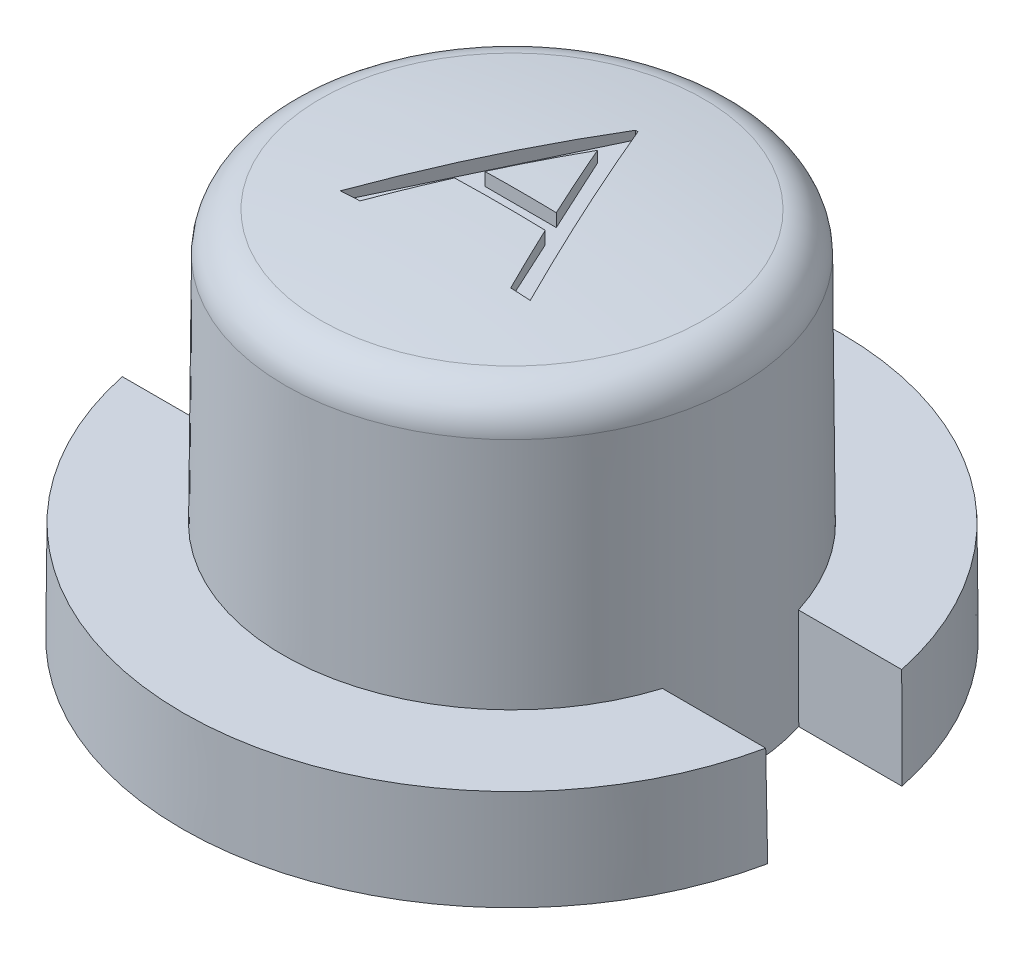
ISO-10303-21;
HEADER;
FILE_DESCRIPTION(('STEP AP214'),'2;1');
FILE_NAME('part.step','',(''),(''),'','','');
FILE_SCHEMA(('AUTOMOTIVE_DESIGN { 1 0 10303 214 1 1 1 1 }'));
ENDSEC;
DATA;
#1=APPLICATION_CONTEXT('core data for automotive mechanical design processes');
#2=APPLICATION_PROTOCOL_DEFINITION('international standard','automotive_design',2000,#1);
#3=PRODUCT_CONTEXT('',#1,'mechanical');
#4=PRODUCT('Part','Part','',(#3));
#5=PRODUCT_RELATED_PRODUCT_CATEGORY('part','',(#4));
#6=PRODUCT_DEFINITION_FORMATION('','',#4);
#7=PRODUCT_DEFINITION_CONTEXT('part definition',#1,'design');
#8=PRODUCT_DEFINITION('design','',#6,#7);
#9=PRODUCT_DEFINITION_SHAPE('','',#8);
#10=(LENGTH_UNIT() NAMED_UNIT(*) SI_UNIT(.MILLI.,.METRE.));
#11=(NAMED_UNIT(*) PLANE_ANGLE_UNIT() SI_UNIT($,.RADIAN.));
#12=(NAMED_UNIT(*) SI_UNIT($,.STERADIAN.) SOLID_ANGLE_UNIT());
#13=UNCERTAINTY_MEASURE_WITH_UNIT(LENGTH_MEASURE(1.E-05),#10,'distance_accuracy_value','');
#14=(GEOMETRIC_REPRESENTATION_CONTEXT(3) GLOBAL_UNCERTAINTY_ASSIGNED_CONTEXT((#13)) GLOBAL_UNIT_ASSIGNED_CONTEXT((#10,
#11,#12)) REPRESENTATION_CONTEXT('',''));
#15=CARTESIAN_POINT('',(0.,0.,0.));
#16=DIRECTION('',(0.,0.,1.));
#17=DIRECTION('',(1.,0.,0.));
#18=AXIS2_PLACEMENT_3D('',#15,#16,#17);
#19=CARTESIAN_POINT('',(0.,3.72622660203488,0.));
#20=DIRECTION('',(0.,-1.,0.));
#21=DIRECTION('',(0.,0.,-1.));
#22=AXIS2_PLACEMENT_3D('',#19,#20,#21);
#23=TOROIDAL_SURFACE('',#22,2.8,0.6);
#24=CARTESIAN_POINT('',(0.,3.72622660203488,2.8));
#25=DIRECTION('',(-1.,0.,0.));
#26=DIRECTION('',(0.,0.,1.));
#27=AXIS2_PLACEMENT_3D('',#24,#25,#26);
#28=CIRCLE('',#27,0.6);
#29=CARTESIAN_POINT('',(0.,3.7366980420568,3.39990861714411));
#30=VERTEX_POINT('',#29);
#31=CARTESIAN_POINT('',(0.,4.3216223168161,2.8741885625966));
#32=VERTEX_POINT('',#31);
#33=EDGE_CURVE('E279',#30,#32,#28,.T.);
#34=ORIENTED_EDGE('',*,*,#33,.F.);
#35=CARTESIAN_POINT('',(0.,3.7366980420568,0.));
#36=DIRECTION('',(0.,-1.,0.));
#37=DIRECTION('',(1.,0.,0.));
#38=AXIS2_PLACEMENT_3D('',#35,#36,#37);
#39=CIRCLE('',#38,3.39990861712735);
#40=EDGE_CURVE('E246',#30,#30,#39,.F.);
#41=ORIENTED_EDGE('',*,*,#40,.T.);
#42=ORIENTED_EDGE('',*,*,#33,.T.);
#43=CARTESIAN_POINT('',(0.,4.3216223168161,0.));
#44=DIRECTION('',(0.,1.,0.));
#45=DIRECTION('',(0.,0.,-1.));
#46=AXIS2_PLACEMENT_3D('',#43,#44,#45);
#47=CIRCLE('',#46,2.8741885625966);
#48=EDGE_CURVE('E266',#32,#32,#47,.T.);
#49=ORIENTED_EDGE('',*,*,#48,.F.);
#50=EDGE_LOOP('',(#34,#41,#42,#49));
#51=FACE_BOUND('',#50,.T.);
#52=ADVANCED_FACE('F44',(#51),#23,.T.);
#53=CARTESIAN_POINT('',(0.0162259615384623,4.3,-1.26526442307692));
#54=DIRECTION('',(-0.903612371936973,0.,-0.428351119156279));
#55=DIRECTION('',(-0.428351119156279,0.,0.903612371936973));
#56=AXIS2_PLACEMENT_3D('',#53,#54,#55);
#57=PLANE('',#56);
#58=DIRECTION('',(0.,1.,0.));
#59=VECTOR('',#58,1.);
#60=CARTESIAN_POINT('',(0.0162259615384623,4.3,-1.26526442307692));
#61=LINE('',#60,#59);
#62=CARTESIAN_POINT('',(0.0162259615384623,4.3,-1.26526442307692));
#63=VERTEX_POINT('',#62);
#64=CARTESIAN_POINT('',(0.0162259615384622,4.46553354961639,-1.26526442307692));
#65=VERTEX_POINT('',#64);
#66=EDGE_CURVE('E295',#63,#65,#61,.T.);
#67=ORIENTED_EDGE('',*,*,#66,.F.);
#68=DIRECTION('',(-0.428351119156279,0.,0.903612371936974));
#69=VECTOR('',#68,1.);
#70=CARTESIAN_POINT('',(0.0162259615384623,4.3,-1.26526442307692));
#71=LINE('',#70,#69);
#72=CARTESIAN_POINT('',(-0.527043269230769,4.3,-0.119230769230769));
#73=VERTEX_POINT('',#72);
#74=EDGE_CURVE('E258',#63,#73,#71,.T.);
#75=ORIENTED_EDGE('',*,*,#74,.T.);
#76=DIRECTION('',(0.,1.,0.));
#77=VECTOR('',#76,1.);
#78=CARTESIAN_POINT('',(-0.527043269230769,4.3,-0.119230769230769));
#79=LINE('',#78,#77);
#80=CARTESIAN_POINT('',(-0.527043269230769,4.49371843316725,-0.119230769230769));
#81=VERTEX_POINT('',#80);
#82=EDGE_CURVE('E151',#73,#81,#79,.T.);
#83=ORIENTED_EDGE('',*,*,#82,.T.);
#84=CARTESIAN_POINT('',(-0.476488766395763,-18.745,-0.225876164038684));
#85=DIRECTION('',(0.903612371936974,0.,0.428351119156279));
#86=DIRECTION('',(-0.428351119156279,0.,0.903612371936974));
#87=AXIS2_PLACEMENT_3D('',#84,#85,#86);
#88=CIRCLE('',#87,23.2390181249986);
#89=EDGE_CURVE('E276',#65,#81,#88,.T.);
#90=ORIENTED_EDGE('',*,*,#89,.F.);
#91=EDGE_LOOP('',(#67,#75,#83,#90));
#92=FACE_BOUND('',#91,.T.);
#93=ADVANCED_FACE('F430',(#92),#57,.T.);
#94=CARTESIAN_POINT('',(-0.527043269230769,4.3,-0.119230769230769));
#95=DIRECTION('',(0.,0.,1.));
#96=DIRECTION('',(1.,0.,0.));
#97=AXIS2_PLACEMENT_3D('',#94,#95,#96);
#98=PLANE('',#97);
#99=ORIENTED_EDGE('',*,*,#82,.F.);
#100=DIRECTION('',(1.,0.,0.));
#101=VECTOR('',#100,1.);
#102=CARTESIAN_POINT('',(-0.527043269230769,4.3,-0.119230769230769));
#103=LINE('',#102,#101);
#104=CARTESIAN_POINT('',(0.545072115384616,4.3,-0.119230769230769));
#105=VERTEX_POINT('',#104);
#106=EDGE_CURVE('E267',#73,#105,#103,.T.);
#107=ORIENTED_EDGE('',*,*,#106,.T.);
#108=DIRECTION('',(0.,1.,0.));
#109=VECTOR('',#108,1.);
#110=CARTESIAN_POINT('',(0.545072115384616,4.3,-0.119230769230769));
#111=LINE('',#110,#109);
#112=CARTESIAN_POINT('',(0.545072115384616,4.49330255015841,-0.119230769230769));
#113=VERTEX_POINT('',#112);
#114=EDGE_CURVE('E257',#105,#113,#111,.T.);
#115=ORIENTED_EDGE('',*,*,#114,.T.);
#116=CARTESIAN_POINT('',(0.,-18.745,-0.119230769230769));
#117=DIRECTION('',(0.,0.,-1.));
#118=DIRECTION('',(1.,0.,0.));
#119=AXIS2_PLACEMENT_3D('',#116,#117,#118);
#120=CIRCLE('',#119,23.2446942123071);
#121=EDGE_CURVE('E129',#81,#113,#120,.T.);
#122=ORIENTED_EDGE('',*,*,#121,.F.);
#123=EDGE_LOOP('',(#99,#107,#115,#122));
#124=FACE_BOUND('',#123,.T.);
#125=ADVANCED_FACE('F221',(#124),#98,.T.);
#126=CARTESIAN_POINT('',(0.545072115384616,4.3,-0.119230769230769));
#127=DIRECTION('',(0.907987253742092,0.,-0.418997788826975));
#128=DIRECTION('',(0.,-1.,0.));
#129=AXIS2_PLACEMENT_3D('',#126,#127,#128);
#130=PLANE('',#129);
#131=ORIENTED_EDGE('',*,*,#114,.F.);
#132=DIRECTION('',(-0.418997788826975,0.,-0.907987253742092));
#133=VECTOR('',#132,1.);
#134=CARTESIAN_POINT('',(0.545072115384616,4.3,-0.119230769230769));
#135=LINE('',#134,#133);
#136=EDGE_CURVE('E254',#105,#63,#135,.T.);
#137=ORIENTED_EDGE('',*,*,#136,.T.);
#138=ORIENTED_EDGE('',*,*,#66,.T.);
#139=CARTESIAN_POINT('',(0.494740428191493,-18.745,-0.228301823182231));
#140=DIRECTION('',(-0.907987253742092,0.,0.418997788826975));
#141=DIRECTION('',(-0.418997788826975,0.,-0.907987253742092));
#142=AXIS2_PLACEMENT_3D('',#139,#140,#141);
#143=CIRCLE('',#142,23.2386130219994);
#144=EDGE_CURVE('E280',#113,#65,#143,.T.);
#145=ORIENTED_EDGE('',*,*,#144,.F.);
#146=EDGE_LOOP('',(#131,#137,#138,#145));
#147=FACE_BOUND('',#146,.T.);
#148=ADVANCED_FACE('F457',(#147),#130,.T.);
#149=CARTESIAN_POINT('',(0.,4.3,0.));
#150=DIRECTION('',(0.,1.,0.));
#151=DIRECTION('',(1.,0.,0.));
#152=AXIS2_PLACEMENT_3D('',#149,#150,#151);
#153=PLANE('',#152);
#154=ORIENTED_EDGE('',*,*,#106,.F.);
#155=ORIENTED_EDGE('',*,*,#74,.F.);
#156=ORIENTED_EDGE('',*,*,#136,.F.);
#157=EDGE_LOOP('',(#154,#155,#156));
#158=FACE_BOUND('',#157,.T.);
#159=DIRECTION('',(-1.,0.,0.));
#160=VECTOR('',#159,1.);
#161=CARTESIAN_POINT('',(0.,4.3,-1.85));
#162=LINE('',#161,#160);
#163=CARTESIAN_POINT('',(0.0384615384615393,4.3,-1.85));
#164=VERTEX_POINT('',#163);
#165=CARTESIAN_POINT('',(0.,4.3,-1.85));
#166=VERTEX_POINT('',#165);
#167=EDGE_CURVE('E310',#164,#166,#162,.T.);
#168=ORIENTED_EDGE('',*,*,#167,.T.);
#169=DIRECTION('',(-0.428584206872173,0.,0.903501841514311));
#170=VECTOR('',#169,1.);
#171=CARTESIAN_POINT('',(-1.42307692307692,4.3,1.15));
#172=LINE('',#171,#170);
#173=CARTESIAN_POINT('',(-1.42307692307692,4.3,1.15));
#174=VERTEX_POINT('',#173);
#175=EDGE_CURVE('E270',#166,#174,#172,.T.);
#176=ORIENTED_EDGE('',*,*,#175,.T.);
#177=DIRECTION('',(1.,0.,0.));
#178=VECTOR('',#177,1.);
#179=CARTESIAN_POINT('',(-1.12920673076923,4.3,1.15));
#180=LINE('',#179,#178);
#181=CARTESIAN_POINT('',(-1.12920673076923,4.3,1.15));
#182=VERTEX_POINT('',#181);
#183=EDGE_CURVE('E262',#174,#182,#180,.T.);
#184=ORIENTED_EDGE('',*,*,#183,.T.);
#185=DIRECTION('',(0.428596026355544,0.,-0.903496234741594));
#186=VECTOR('',#185,1.);
#187=CARTESIAN_POINT('',(-0.673076923076922,4.3,0.188461538461538));
#188=LINE('',#187,#186);
#189=CARTESIAN_POINT('',(-0.673076923076922,4.3,0.188461538461538));
#190=VERTEX_POINT('',#189);
#191=EDGE_CURVE('E231',#182,#190,#188,.T.);
#192=ORIENTED_EDGE('',*,*,#191,.T.);
#193=DIRECTION('',(1.,0.,0.));
#194=VECTOR('',#193,1.);
#195=CARTESIAN_POINT('',(0.686899038461539,4.3,0.188461538461538));
#196=LINE('',#195,#194);
#197=CARTESIAN_POINT('',(0.686899038461539,4.3,0.188461538461538));
#198=VERTEX_POINT('',#197);
#199=EDGE_CURVE('E281',#190,#198,#196,.T.);
#200=ORIENTED_EDGE('',*,*,#199,.T.);
#201=DIRECTION('',(0.418842224744608,0.,0.908059023836549));
#202=VECTOR('',#201,1.);
#203=CARTESIAN_POINT('',(1.13040865384616,4.3,1.15));
#204=LINE('',#203,#202);
#205=CARTESIAN_POINT('',(1.13040865384616,4.3,1.15));
#206=VERTEX_POINT('',#205);
#207=EDGE_CURVE('E271',#198,#206,#204,.T.);
#208=ORIENTED_EDGE('',*,*,#207,.T.);
#209=DIRECTION('',(1.,0.,0.));
#210=VECTOR('',#209,1.);
#211=CARTESIAN_POINT('',(1.42307692307692,4.3,1.15));
#212=LINE('',#211,#210);
#213=CARTESIAN_POINT('',(1.42307692307692,4.3,1.15));
#214=VERTEX_POINT('',#213);
#215=EDGE_CURVE('E320',#206,#214,#212,.T.);
#216=ORIENTED_EDGE('',*,*,#215,.T.);
#217=DIRECTION('',(-0.419058177461747,0.,-0.907959384500452));
#218=VECTOR('',#217,1.);
#219=CARTESIAN_POINT('',(0.0384615384615393,4.3,-1.85));
#220=LINE('',#219,#218);
#221=EDGE_CURVE('E298',#214,#164,#220,.T.);
#222=ORIENTED_EDGE('',*,*,#221,.T.);
#223=EDGE_LOOP('',(#168,#176,#184,#192,#200,#208,#216,#222));
#224=FACE_BOUND('',#223,.T.);
#225=ADVANCED_FACE('F452',(#158,#224),#153,.T.);
#226=CARTESIAN_POINT('',(-1.42307692307692,4.3,1.15));
#227=DIRECTION('',(-0.903501841514311,0.,-0.428584206872173));
#228=DIRECTION('',(-0.428584206872173,0.,0.903501841514311));
#229=AXIS2_PLACEMENT_3D('',#226,#227,#228);
#230=PLANE('',#229);
#231=CARTESIAN_POINT('',(-0.716369247282973,-18.745,-0.339816181403461));
#232=DIRECTION('',(0.903501841514311,0.,0.428584206872173));
#233=DIRECTION('',(-0.428584206872173,0.,0.903501841514311));
#234=AXIS2_PLACEMENT_3D('',#231,#232,#233);
#235=CIRCLE('',#234,23.2314735878807);
#236=CARTESIAN_POINT('',(0.,4.42626507120403,-1.85));
#237=VERTEX_POINT('',#236);
#238=CARTESIAN_POINT('',(-1.42307692307692,4.42788020663392,1.15));
#239=VERTEX_POINT('',#238);
#240=EDGE_CURVE('E252',#237,#239,#235,.T.);
#241=ORIENTED_EDGE('',*,*,#240,.T.);
#242=DIRECTION('',(0.,1.,0.));
#243=VECTOR('',#242,1.);
#244=CARTESIAN_POINT('',(-1.42307692307692,4.3,1.15));
#245=LINE('',#244,#243);
#246=EDGE_CURVE('E292',#174,#239,#245,.T.);
#247=ORIENTED_EDGE('',*,*,#246,.F.);
#248=ORIENTED_EDGE('',*,*,#175,.F.);
#249=DIRECTION('',(0.,1.,0.));
#250=VECTOR('',#249,1.);
#251=CARTESIAN_POINT('',(0.,4.3,-1.85));
#252=LINE('',#251,#250);
#253=EDGE_CURVE('E313',#166,#237,#252,.T.);
#254=ORIENTED_EDGE('',*,*,#253,.T.);
#255=EDGE_LOOP('',(#241,#247,#248,#254));
#256=FACE_BOUND('',#255,.T.);
#257=ADVANCED_FACE('F448',(#256),#230,.F.);
#258=CARTESIAN_POINT('',(-1.12920673076923,4.3,1.15));
#259=DIRECTION('',(0.,0.,1.));
#260=DIRECTION('',(1.,0.,0.));
#261=AXIS2_PLACEMENT_3D('',#258,#259,#260);
#262=PLANE('',#261);
#263=CARTESIAN_POINT('',(0.,-18.745,1.15));
#264=DIRECTION('',(0.,0.,-1.));
#265=DIRECTION('',(1.,0.,0.));
#266=AXIS2_PLACEMENT_3D('',#263,#264,#265);
#267=CIRCLE('',#266,23.2165355942698);
#268=CARTESIAN_POINT('',(-1.12920673076923,4.44405813436987,1.15));
#269=VERTEX_POINT('',#268);
#270=EDGE_CURVE('E249',#239,#269,#267,.T.);
#271=ORIENTED_EDGE('',*,*,#270,.T.);
#272=DIRECTION('',(0.,1.,0.));
#273=VECTOR('',#272,1.);
#274=CARTESIAN_POINT('',(-1.12920673076923,4.3,1.15));
#275=LINE('',#274,#273);
#276=EDGE_CURVE('E259',#182,#269,#275,.T.);
#277=ORIENTED_EDGE('',*,*,#276,.F.);
#278=ORIENTED_EDGE('',*,*,#183,.F.);
#279=ORIENTED_EDGE('',*,*,#246,.T.);
#280=EDGE_LOOP('',(#271,#277,#278,#279));
#281=FACE_BOUND('',#280,.T.);
#282=ADVANCED_FACE('F451',(#281),#262,.F.);
#283=CARTESIAN_POINT('',(-0.673076923076922,4.3,0.188461538461538));
#284=DIRECTION('',(0.903496234741594,0.,0.428596026355544));
#285=DIRECTION('',(0.,-1.,0.));
#286=AXIS2_PLACEMENT_3D('',#283,#284,#285);
#287=PLANE('',#286);
#288=CARTESIAN_POINT('',(-0.476457473760795,-18.745,-0.226019514115277));
#289=DIRECTION('',(-0.903496234741594,0.,-0.428596026355544));
#290=DIRECTION('',(0.428596026355544,0.,-0.903496234741594));
#291=AXIS2_PLACEMENT_3D('',#288,#289,#290);
#292=CIRCLE('',#291,23.2390173728351);
#293=CARTESIAN_POINT('',(-0.673076923076922,4.48948890559338,0.188461538461538));
#294=VERTEX_POINT('',#293);
#295=EDGE_CURVE('E253',#269,#294,#292,.T.);
#296=ORIENTED_EDGE('',*,*,#295,.T.);
#297=DIRECTION('',(0.,1.,0.));
#298=VECTOR('',#297,1.);
#299=CARTESIAN_POINT('',(-0.673076923076922,4.3,0.188461538461538));
#300=LINE('',#299,#298);
#301=EDGE_CURVE('E284',#190,#294,#300,.T.);
#302=ORIENTED_EDGE('',*,*,#301,.F.);
#303=ORIENTED_EDGE('',*,*,#191,.F.);
#304=ORIENTED_EDGE('',*,*,#276,.T.);
#305=EDGE_LOOP('',(#296,#302,#303,#304));
#306=FACE_BOUND('',#305,.T.);
#307=ADVANCED_FACE('F455',(#306),#287,.F.);
#308=CARTESIAN_POINT('',(0.686899038461539,4.3,0.188461538461538));
#309=DIRECTION('',(0.,0.,1.));
#310=DIRECTION('',(1.,0.,0.));
#311=AXIS2_PLACEMENT_3D('',#308,#309,#310);
#312=PLANE('',#311);
#313=CARTESIAN_POINT('',(0.,-18.745,0.188461538461538));
#314=DIRECTION('',(0.,0.,-1.));
#315=DIRECTION('',(1.,0.,0.));
#316=AXIS2_PLACEMENT_3D('',#313,#314,#315);
#317=CIRCLE('',#316,23.2442360005339);
#318=CARTESIAN_POINT('',(0.686899038461539,4.48908437962386,0.188461538461538));
#319=VERTEX_POINT('',#318);
#320=EDGE_CURVE('E263',#294,#319,#317,.T.);
#321=ORIENTED_EDGE('',*,*,#320,.T.);
#322=DIRECTION('',(0.,1.,0.));
#323=VECTOR('',#322,1.);
#324=CARTESIAN_POINT('',(0.686899038461539,4.3,0.188461538461538));
#325=LINE('',#324,#323);
#326=EDGE_CURVE('E274',#198,#319,#325,.T.);
#327=ORIENTED_EDGE('',*,*,#326,.F.);
#328=ORIENTED_EDGE('',*,*,#199,.F.);
#329=ORIENTED_EDGE('',*,*,#301,.T.);
#330=EDGE_LOOP('',(#321,#327,#328,#329));
#331=FACE_BOUND('',#330,.T.);
#332=ADVANCED_FACE('F439',(#331),#312,.F.);
#333=CARTESIAN_POINT('',(1.13040865384616,4.3,1.15));
#334=DIRECTION('',(-0.908059023836549,0.,0.418842224744609));
#335=DIRECTION('',(0.,1.,0.));
#336=AXIS2_PLACEMENT_3D('',#333,#334,#335);
#337=PLANE('',#336);
#338=CARTESIAN_POINT('',(0.494718928755167,-18.745,-0.228189105888321));
#339=DIRECTION('',(0.908059023836549,0.,-0.418842224744609));
#340=DIRECTION('',(0.418842224744609,0.,0.908059023836549));
#341=AXIS2_PLACEMENT_3D('',#338,#339,#340);
#342=CIRCLE('',#341,23.2386145867924);
#343=CARTESIAN_POINT('',(1.13040865384616,4.44399957469726,1.15));
#344=VERTEX_POINT('',#343);
#345=EDGE_CURVE('E288',#319,#344,#342,.T.);
#346=ORIENTED_EDGE('',*,*,#345,.T.);
#347=DIRECTION('',(0.,1.,0.));
#348=VECTOR('',#347,1.);
#349=CARTESIAN_POINT('',(1.13040865384616,4.3,1.15));
#350=LINE('',#349,#348);
#351=EDGE_CURVE('E275',#206,#344,#350,.T.);
#352=ORIENTED_EDGE('',*,*,#351,.F.);
#353=ORIENTED_EDGE('',*,*,#207,.F.);
#354=ORIENTED_EDGE('',*,*,#326,.T.);
#355=EDGE_LOOP('',(#346,#352,#353,#354));
#356=FACE_BOUND('',#355,.T.);
#357=ADVANCED_FACE('F444',(#356),#337,.F.);
#358=CARTESIAN_POINT('',(1.42307692307692,4.3,1.15));
#359=DIRECTION('',(0.,0.,1.));
#360=DIRECTION('',(1.,0.,0.));
#361=AXIS2_PLACEMENT_3D('',#358,#359,#360);
#362=PLANE('',#361);
#363=CARTESIAN_POINT('',(0.,-18.745,1.15));
#364=DIRECTION('',(0.,0.,-1.));
#365=DIRECTION('',(1.,-2.52252384130178E-13,0.));
#366=AXIS2_PLACEMENT_3D('',#363,#364,#365);
#367=CIRCLE('',#366,23.2165355942698);
#368=CARTESIAN_POINT('',(1.42307692307692,4.42788020663392,1.15));
#369=VERTEX_POINT('',#368);
#370=EDGE_CURVE('E285',#344,#369,#367,.T.);
#371=ORIENTED_EDGE('',*,*,#370,.T.);
#372=DIRECTION('',(0.,1.,0.));
#373=VECTOR('',#372,1.);
#374=CARTESIAN_POINT('',(1.42307692307692,4.3,1.15));
#375=LINE('',#374,#373);
#376=EDGE_CURVE('E301',#214,#369,#375,.T.);
#377=ORIENTED_EDGE('',*,*,#376,.F.);
#378=ORIENTED_EDGE('',*,*,#215,.F.);
#379=ORIENTED_EDGE('',*,*,#351,.T.);
#380=EDGE_LOOP('',(#371,#377,#378,#379));
#381=FACE_BOUND('',#380,.T.);
#382=ADVANCED_FACE('F443',(#381),#362,.F.);
#383=CARTESIAN_POINT('',(0.0384615384615393,4.3,-1.85));
#384=DIRECTION('',(0.907959384500452,0.,-0.419058177461747));
#385=DIRECTION('',(0.,-1.,0.));
#386=AXIS2_PLACEMENT_3D('',#383,#384,#385);
#387=PLANE('',#386);
#388=CARTESIAN_POINT('',(0.735609756097562,-18.745,-0.339512195121952));
#389=DIRECTION('',(-0.907959384500452,0.,0.419058177461747));
#390=DIRECTION('',(-0.419058177461747,0.,-0.907959384500452));
#391=AXIS2_PLACEMENT_3D('',#388,#389,#390);
#392=CIRCLE('',#391,23.2308767539259);
#393=CARTESIAN_POINT('',(0.0384615384615393,4.42623315039705,-1.85));
#394=VERTEX_POINT('',#393);
#395=EDGE_CURVE('E289',#369,#394,#392,.T.);
#396=ORIENTED_EDGE('',*,*,#395,.T.);
#397=DIRECTION('',(0.,1.,0.));
#398=VECTOR('',#397,1.);
#399=CARTESIAN_POINT('',(0.0384615384615393,4.3,-1.85));
#400=LINE('',#399,#398);
#401=EDGE_CURVE('E302',#164,#394,#400,.T.);
#402=ORIENTED_EDGE('',*,*,#401,.F.);
#403=ORIENTED_EDGE('',*,*,#221,.F.);
#404=ORIENTED_EDGE('',*,*,#376,.T.);
#405=EDGE_LOOP('',(#396,#402,#403,#404));
#406=FACE_BOUND('',#405,.T.);
#407=ADVANCED_FACE('F352',(#406),#387,.F.);
#408=CARTESIAN_POINT('',(0.,4.3,-1.85));
#409=DIRECTION('',(0.,0.,-1.));
#410=DIRECTION('',(0.,-1.,0.));
#411=AXIS2_PLACEMENT_3D('',#408,#409,#410);
#412=PLANE('',#411);
#413=CARTESIAN_POINT('',(0.,-18.745,-1.85));
#414=DIRECTION('',(0.,0.,1.));
#415=DIRECTION('',(-1.,-6.29766818301678E-13,0.));
#416=AXIS2_PLACEMENT_3D('',#413,#414,#415);
#417=CIRCLE('',#416,23.1712650712039);
#418=EDGE_CURVE('E307',#394,#237,#417,.T.);
#419=ORIENTED_EDGE('',*,*,#418,.T.);
#420=ORIENTED_EDGE('',*,*,#253,.F.);
#421=ORIENTED_EDGE('',*,*,#167,.F.);
#422=ORIENTED_EDGE('',*,*,#401,.T.);
#423=EDGE_LOOP('',(#419,#420,#421,#422));
#424=FACE_BOUND('',#423,.T.);
#425=ADVANCED_FACE('F369',(#424),#412,.F.);
#426=CARTESIAN_POINT('',(0.,-18.745,0.));
#427=DIRECTION('',(-1.,0.,0.));
#428=DIRECTION('',(0.,0.,1.));
#429=AXIS2_PLACEMENT_3D('',#426,#427,#428);
#430=SPHERICAL_SURFACE('',#429,23.245);
#431=ORIENTED_EDGE('',*,*,#320,.F.);
#432=ORIENTED_EDGE('',*,*,#295,.F.);
#433=ORIENTED_EDGE('',*,*,#270,.F.);
#434=ORIENTED_EDGE('',*,*,#240,.F.);
#435=ORIENTED_EDGE('',*,*,#418,.F.);
#436=ORIENTED_EDGE('',*,*,#395,.F.);
#437=ORIENTED_EDGE('',*,*,#370,.F.);
#438=ORIENTED_EDGE('',*,*,#345,.F.);
#439=EDGE_LOOP('',(#431,#432,#433,#434,#435,#436,#437,#438));
#440=FACE_BOUND('',#439,.T.);
#441=ORIENTED_EDGE('',*,*,#48,.T.);
#442=EDGE_LOOP('',(#441));
#443=FACE_BOUND('',#442,.T.);
#444=ADVANCED_FACE('F364',(#440,#443),#430,.T.);
#445=CARTESIAN_POINT('',(0.,-18.745,0.));
#446=DIRECTION('',(-1.,0.,0.));
#447=DIRECTION('',(0.,0.,1.));
#448=AXIS2_PLACEMENT_3D('',#445,#446,#447);
#449=SPHERICAL_SURFACE('',#448,23.245);
#450=ORIENTED_EDGE('',*,*,#121,.T.);
#451=ORIENTED_EDGE('',*,*,#144,.T.);
#452=ORIENTED_EDGE('',*,*,#89,.T.);
#453=EDGE_LOOP('',(#450,#451,#452));
#454=FACE_BOUND('',#453,.T.);
#455=ADVANCED_FACE('F464',(#454),#449,.T.);
#456=CARTESIAN_POINT('',(0.,-1.25,0.));
#457=DIRECTION('',(0.,1.,0.));
#458=DIRECTION('',(1.,0.,0.));
#459=AXIS2_PLACEMENT_3D('',#456,#457,#458);
#460=PLANE('',#459);
#461=CARTESIAN_POINT('',(0.,-1.25,0.));
#462=DIRECTION('',(0.,1.,0.));
#463=DIRECTION('',(0.,0.,1.));
#464=AXIS2_PLACEMENT_3D('',#461,#462,#463);
#465=CIRCLE('',#464,2.08803388836174);
#466=CARTESIAN_POINT('',(0.,-1.25,2.08803388836174));
#467=VERTEX_POINT('',#466);
#468=EDGE_CURVE('E144',#467,#467,#465,.T.);
#469=ORIENTED_EDGE('',*,*,#468,.T.);
#470=EDGE_LOOP('',(#469));
#471=FACE_BOUND('',#470,.T.);
#472=CARTESIAN_POINT('',(0.,-1.25,0.));
#473=DIRECTION('',(0.,1.,0.));
#474=DIRECTION('',(0.,0.,1.));
#475=AXIS2_PLACEMENT_3D('',#472,#473,#474);
#476=CIRCLE('',#475,3.44342687165278);
#477=CARTESIAN_POINT('',(-3.29303135116183,-1.25,-1.00654515084307));
#478=VERTEX_POINT('',#477);
#479=CARTESIAN_POINT('',(-3.29303135116184,-1.25,1.00654515084307));
#480=VERTEX_POINT('',#479);
#481=EDGE_CURVE('E130',#478,#480,#476,.T.);
#482=ORIENTED_EDGE('',*,*,#481,.F.);
#483=DIRECTION('',(-1.,0.,0.));
#484=VECTOR('',#483,1.);
#485=CARTESIAN_POINT('',(4.84790913936014,-1.25,-1.00654515084307));
#486=LINE('',#485,#484);
#487=CARTESIAN_POINT('',(-4.83986942950872,-1.25,-1.00654515084307));
#488=VERTEX_POINT('',#487);
#489=EDGE_CURVE('E88',#478,#488,#486,.T.);
#490=ORIENTED_EDGE('',*,*,#489,.T.);
#491=CARTESIAN_POINT('',(0.,-1.25,0.));
#492=DIRECTION('',(0.,1.,0.));
#493=DIRECTION('',(0.,0.,1.));
#494=AXIS2_PLACEMENT_3D('',#491,#492,#493);
#495=CIRCLE('',#494,4.94342687165277);
#496=CARTESIAN_POINT('',(4.83986942950872,-1.25,-1.00654515084307));
#497=VERTEX_POINT('',#496);
#498=EDGE_CURVE('E137',#488,#497,#495,.F.);
#499=ORIENTED_EDGE('',*,*,#498,.T.);
#500=DIRECTION('',(-1.,0.,0.));
#501=VECTOR('',#500,1.);
#502=CARTESIAN_POINT('',(4.84790913936014,-1.25,-1.00654515084307));
#503=LINE('',#502,#501);
#504=CARTESIAN_POINT('',(3.29303135116183,-1.25,-1.00654515084307));
#505=VERTEX_POINT('',#504);
#506=EDGE_CURVE('E133',#497,#505,#503,.T.);
#507=ORIENTED_EDGE('',*,*,#506,.T.);
#508=CARTESIAN_POINT('',(0.,-1.25,0.));
#509=DIRECTION('',(0.,1.,0.));
#510=DIRECTION('',(0.,0.,1.));
#511=AXIS2_PLACEMENT_3D('',#508,#509,#510);
#512=CIRCLE('',#511,3.44342687165278);
#513=CARTESIAN_POINT('',(3.29303135116183,-1.25,1.00654515084307));
#514=VERTEX_POINT('',#513);
#515=EDGE_CURVE('E123',#514,#505,#512,.T.);
#516=ORIENTED_EDGE('',*,*,#515,.F.);
#517=DIRECTION('',(1.,0.,0.));
#518=VECTOR('',#517,1.);
#519=CARTESIAN_POINT('',(4.84790913936014,-1.25,1.00654515084307));
#520=LINE('',#519,#518);
#521=CARTESIAN_POINT('',(4.83986942950872,-1.25,1.00654515084307));
#522=VERTEX_POINT('',#521);
#523=EDGE_CURVE('E115',#514,#522,#520,.T.);
#524=ORIENTED_EDGE('',*,*,#523,.T.);
#525=CARTESIAN_POINT('',(0.,-1.25,0.));
#526=DIRECTION('',(0.,1.,0.));
#527=DIRECTION('',(0.,0.,1.));
#528=AXIS2_PLACEMENT_3D('',#525,#526,#527);
#529=CIRCLE('',#528,4.94342687165277);
#530=CARTESIAN_POINT('',(-4.83986942950872,-1.25,1.00654515084307));
#531=VERTEX_POINT('',#530);
#532=EDGE_CURVE('E167',#522,#531,#529,.F.);
#533=ORIENTED_EDGE('',*,*,#532,.T.);
#534=DIRECTION('',(1.,0.,0.));
#535=VECTOR('',#534,1.);
#536=CARTESIAN_POINT('',(4.84790913936014,-1.25,1.00654515084307));
#537=LINE('',#536,#535);
#538=EDGE_CURVE('E157',#531,#480,#537,.T.);
#539=ORIENTED_EDGE('',*,*,#538,.T.);
#540=EDGE_LOOP('',(#482,#490,#499,#507,#516,#524,#533,#539));
#541=FACE_BOUND('',#540,.T.);
#542=ADVANCED_FACE('F135',(#471,#541),#460,.F.);
#543=CARTESIAN_POINT('',(0.,3.72622660203488,0.));
#544=DIRECTION('',(0.,-1.,0.));
#545=DIRECTION('',(1.,0.,0.));
#546=AXIS2_PLACEMENT_3D('',#543,#544,#545);
#547=CONICAL_SURFACE('',#546,3.4,0.0087266462599642);
#548=CARTESIAN_POINT('',(3.26973350285921,0.718597748165332,-1.02372484312449));
#549=CARTESIAN_POINT('',(3.27653711266679,0.14573232412735,-1.01872552230702));
#550=CARTESIAN_POINT('',(3.28331987905421,-0.427133345920848,-1.01372619934264));
#551=CARTESIAN_POINT('',(3.29684372498869,-1.57286517803107,-1.00372754912015));
#552=CARTESIAN_POINT('',(3.30358480453575,-2.14573134009309,-0.998728221862038));
#553=CARTESIAN_POINT('',(3.31030504066266,-2.71859774816533,-0.993728892457024));
#554=B_SPLINE_CURVE_WITH_KNOTS('',3,(#548,#549,#550,#551,#552,#553),.UNSPECIFIED.,.F.,.F.,(4,2,
4),(0.,1.71878290532215,3.43756581062447),.UNSPECIFIED.);
#555=CARTESIAN_POINT('',(3.27529426574104,0.25,-1.01963545252921));
#556=VERTEX_POINT('',#555);
#557=EDGE_CURVE('E12',#556,#505,#554,.T.);
#558=ORIENTED_EDGE('',*,*,#557,.F.);
#559=CARTESIAN_POINT('',(0.,0.25,0.));
#560=DIRECTION('',(0.,-1.,0.));
#561=DIRECTION('',(0.,0.,-1.));
#562=AXIS2_PLACEMENT_3D('',#559,#560,#561);
#563=CIRCLE('',#562,3.43033656996665);
#564=CARTESIAN_POINT('',(-3.27529426574104,0.25,-1.01963545252921));
#565=VERTEX_POINT('',#564);
#566=EDGE_CURVE('E62',#556,#565,#563,.F.);
#567=ORIENTED_EDGE('',*,*,#566,.T.);
#568=CARTESIAN_POINT('',(-3.31030504066266,-2.71859774816533,-0.993728892457024));
#569=CARTESIAN_POINT('',(-3.30358480453575,-2.14573134009309,-0.998728221862038));
#570=CARTESIAN_POINT('',(-3.29684372498869,-1.57286517803107,-1.00372754912015));
#571=CARTESIAN_POINT('',(-3.28331987905421,-0.427133345920848,-1.01372619934264));
#572=CARTESIAN_POINT('',(-3.27653711266679,0.14573232412735,-1.01872552230702));
#573=CARTESIAN_POINT('',(-3.26973350285921,0.718597748165332,-1.02372484312449));
#574=B_SPLINE_CURVE_WITH_KNOTS('',3,(#568,#569,#570,#571,#572,#573),.UNSPECIFIED.,.F.,.F.,(4,2,
4),(0.,1.71878290530232,3.43756581062447),.UNSPECIFIED.);
#575=EDGE_CURVE('E54',#478,#565,#574,.T.);
#576=ORIENTED_EDGE('',*,*,#575,.F.);
#577=ORIENTED_EDGE('',*,*,#481,.T.);
#578=CARTESIAN_POINT('',(-3.26973350285921,0.718597748165332,1.02372484312449));
#579=CARTESIAN_POINT('',(-3.27653711266679,0.14573232412735,1.01872552230702));
#580=CARTESIAN_POINT('',(-3.28331987905421,-0.427133345920848,1.01372619934264));
#581=CARTESIAN_POINT('',(-3.29684372498869,-1.57286517803107,1.00372754912015));
#582=CARTESIAN_POINT('',(-3.30358480453575,-2.14573134009309,0.998728221862037));
#583=CARTESIAN_POINT('',(-3.31030504066266,-2.71859774816533,0.993728892457024));
#584=B_SPLINE_CURVE_WITH_KNOTS('',3,(#578,#579,#580,#581,#582,#583),.UNSPECIFIED.,.F.,.F.,(4,2,
4),(0.,1.71878290532215,3.43756581062447),.UNSPECIFIED.);
#585=CARTESIAN_POINT('',(-3.27529426574104,0.25,1.01963545252921));
#586=VERTEX_POINT('',#585);
#587=EDGE_CURVE('E160',#586,#480,#584,.T.);
#588=ORIENTED_EDGE('',*,*,#587,.F.);
#589=CARTESIAN_POINT('',(0.,0.25,0.));
#590=DIRECTION('',(0.,-1.,0.));
#591=DIRECTION('',(0.,0.,-1.));
#592=AXIS2_PLACEMENT_3D('',#589,#590,#591);
#593=CIRCLE('',#592,3.43033656996665);
#594=CARTESIAN_POINT('',(3.27529426574104,0.25,1.01963545252921));
#595=VERTEX_POINT('',#594);
#596=EDGE_CURVE('E149',#586,#595,#593,.F.);
#597=ORIENTED_EDGE('',*,*,#596,.T.);
#598=CARTESIAN_POINT('',(3.31030504066266,-2.71859774816533,0.993728892457024));
#599=CARTESIAN_POINT('',(3.30358480453575,-2.14573134009309,0.998728221862037));
#600=CARTESIAN_POINT('',(3.29684372498869,-1.57286517803107,1.00372754912015));
#601=CARTESIAN_POINT('',(3.28331987905421,-0.427133345920848,1.01372619934264));
#602=CARTESIAN_POINT('',(3.27653711266679,0.14573232412735,1.01872552230702));
#603=CARTESIAN_POINT('',(3.26973350285921,0.718597748165332,1.02372484312449));
#604=B_SPLINE_CURVE_WITH_KNOTS('',3,(#598,#599,#600,#601,#602,#603),.UNSPECIFIED.,.F.,.F.,(4,2,
4),(0.,1.71878290530232,3.43756581062447),.UNSPECIFIED.);
#605=EDGE_CURVE('E127',#514,#595,#604,.T.);
#606=ORIENTED_EDGE('',*,*,#605,.F.);
#607=ORIENTED_EDGE('',*,*,#515,.T.);
#608=EDGE_LOOP('',(#558,#567,#576,#577,#588,#597,#606,#607));
#609=FACE_BOUND('',#608,.T.);
#610=ORIENTED_EDGE('',*,*,#40,.F.);
#611=EDGE_LOOP('',(#610));
#612=FACE_BOUND('',#611,.T.);
#613=ADVANCED_FACE('F124',(#609,#612),#547,.T.);
#614=CARTESIAN_POINT('',(4.84790913936014,-2.,1.));
#615=DIRECTION('',(0.,0.00872653549837395,-0.999961923064171));
#616=DIRECTION('',(0.,0.999961923064171,0.00872653549837395));
#617=AXIS2_PLACEMENT_3D('',#614,#615,#616);
#618=PLANE('',#617);
#619=DIRECTION('',(1.,0.,0.));
#620=VECTOR('',#619,1.);
#621=CARTESIAN_POINT('',(0.,0.25,1.01963545252921));
#622=LINE('',#621,#620);
#623=CARTESIAN_POINT('',(-4.82374981078993,0.25,1.01963545252921));
#624=VERTEX_POINT('',#623);
#625=EDGE_CURVE('E154',#624,#586,#622,.T.);
#626=ORIENTED_EDGE('',*,*,#625,.T.);
#627=ORIENTED_EDGE('',*,*,#587,.T.);
#628=ORIENTED_EDGE('',*,*,#538,.F.);
#629=CARTESIAN_POINT('',(-4.78205311615585,4.10684322329632,1.0532936134286));
#630=CARTESIAN_POINT('',(-4.7969165201097,2.73789621162842,1.04134699384522));
#631=CARTESIAN_POINT('',(-4.8117121989267,1.36894847052964,1.02940036789619));
#632=CARTESIAN_POINT('',(-4.83361254327772,-0.666666493674199,1.01163582523069));
#633=CARTESIAN_POINT('',(-4.84076887219549,-1.33333316034087,1.00581791337019));
#634=CARTESIAN_POINT('',(-4.84790913936014,-2.,1.));
#635=B_SPLINE_CURVE_WITH_KNOTS('',3,(#629,#630,#631,#632,#633,#634),.UNSPECIFIED.,.F.,.F.,(4,2,
4),(0.,4.10723945814996,6.10743083656302),.UNSPECIFIED.);
#636=EDGE_CURVE('E108',#624,#531,#635,.T.);
#637=ORIENTED_EDGE('',*,*,#636,.F.);
#638=EDGE_LOOP('',(#626,#627,#628,#637));
#639=FACE_BOUND('',#638,.T.);
#640=ADVANCED_FACE('F218',(#639),#618,.T.);
#641=CARTESIAN_POINT('',(0.,-2.,0.));
#642=DIRECTION('',(0.,-1.,0.));
#643=DIRECTION('',(0.,0.,-1.));
#644=AXIS2_PLACEMENT_3D('',#641,#642,#643);
#645=CONICAL_SURFACE('',#644,4.94997202249584,0.00872664625997167);
#646=ORIENTED_EDGE('',*,*,#532,.F.);
#647=CARTESIAN_POINT('',(4.78205311615585,4.10684322329632,1.0532936134286));
#648=CARTESIAN_POINT('',(4.7969165201097,2.73789621162842,1.04134699384522));
#649=CARTESIAN_POINT('',(4.8117121989267,1.36894847052964,1.02940036789619));
#650=CARTESIAN_POINT('',(4.83361254327772,-0.666666493674199,1.01163582523069));
#651=CARTESIAN_POINT('',(4.84076887219549,-1.33333316034087,1.00581791337019));
#652=CARTESIAN_POINT('',(4.84790913936014,-2.,1.));
#653=B_SPLINE_CURVE_WITH_KNOTS('',3,(#647,#648,#649,#650,#651,#652),.UNSPECIFIED.,.F.,.F.,(4,2,
4),(0.,4.10723945814996,6.10743083656302),.UNSPECIFIED.);
#654=CARTESIAN_POINT('',(4.82374981078993,0.25,1.01963545252921));
#655=VERTEX_POINT('',#654);
#656=EDGE_CURVE('E180',#655,#522,#653,.T.);
#657=ORIENTED_EDGE('',*,*,#656,.F.);
#658=CARTESIAN_POINT('',(0.,0.25,0.));
#659=DIRECTION('',(0.,-1.,0.));
#660=DIRECTION('',(0.,0.,-1.));
#661=AXIS2_PLACEMENT_3D('',#658,#659,#660);
#662=CIRCLE('',#661,4.93033656996664);
#663=EDGE_CURVE('E155',#655,#624,#662,.T.);
#664=ORIENTED_EDGE('',*,*,#663,.T.);
#665=ORIENTED_EDGE('',*,*,#636,.T.);
#666=EDGE_LOOP('',(#646,#657,#664,#665));
#667=FACE_BOUND('',#666,.T.);
#668=ADVANCED_FACE('F219',(#667),#645,.T.);
#669=ORIENTED_EDGE('',*,*,#523,.F.);
#670=ORIENTED_EDGE('',*,*,#605,.T.);
#671=DIRECTION('',(1.,0.,0.));
#672=VECTOR('',#671,1.);
#673=CARTESIAN_POINT('',(0.,0.25,1.01963545252921));
#674=LINE('',#673,#672);
#675=EDGE_CURVE('E152',#595,#655,#674,.T.);
#676=ORIENTED_EDGE('',*,*,#675,.T.);
#677=ORIENTED_EDGE('',*,*,#656,.T.);
#678=EDGE_LOOP('',(#669,#670,#676,#677));
#679=FACE_BOUND('',#678,.T.);
#680=ADVANCED_FACE('F233',(#679),#618,.T.);
#681=CARTESIAN_POINT('',(0.,0.25,0.));
#682=DIRECTION('',(0.,-1.,0.));
#683=DIRECTION('',(0.,0.,-1.));
#684=AXIS2_PLACEMENT_3D('',#681,#682,#683);
#685=PLANE('',#684);
#686=ORIENTED_EDGE('',*,*,#596,.F.);
#687=ORIENTED_EDGE('',*,*,#625,.F.);
#688=ORIENTED_EDGE('',*,*,#663,.F.);
#689=ORIENTED_EDGE('',*,*,#675,.F.);
#690=EDGE_LOOP('',(#686,#687,#688,#689));
#691=FACE_BOUND('',#690,.T.);
#692=ADVANCED_FACE('F236',(#691),#685,.F.);
#693=CARTESIAN_POINT('',(4.84790913936014,-2.,-1.));
#694=DIRECTION('',(0.,0.00872653549837395,0.999961923064171));
#695=DIRECTION('',(0.,-0.999961923064171,0.00872653549837395));
#696=AXIS2_PLACEMENT_3D('',#693,#694,#695);
#697=PLANE('',#696);
#698=DIRECTION('',(-1.,0.,0.));
#699=VECTOR('',#698,1.);
#700=CARTESIAN_POINT('',(0.,0.25,-1.01963545252921));
#701=LINE('',#700,#699);
#702=CARTESIAN_POINT('',(4.82374981078993,0.25,-1.01963545252921));
#703=VERTEX_POINT('',#702);
#704=EDGE_CURVE('E48',#703,#556,#701,.T.);
#705=ORIENTED_EDGE('',*,*,#704,.T.);
#706=ORIENTED_EDGE('',*,*,#557,.T.);
#707=ORIENTED_EDGE('',*,*,#506,.F.);
#708=CARTESIAN_POINT('',(4.78205311615585,4.10684322329632,-1.0532936134286));
#709=CARTESIAN_POINT('',(4.7969165201097,2.73789621162842,-1.04134699384522));
#710=CARTESIAN_POINT('',(4.8117121989267,1.36894847052964,-1.02940036789619));
#711=CARTESIAN_POINT('',(4.83361254327772,-0.666666493674199,-1.01163582523069));
#712=CARTESIAN_POINT('',(4.84076887219549,-1.33333316034087,-1.00581791337019));
#713=CARTESIAN_POINT('',(4.84790913936014,-2.,-1.));
#714=B_SPLINE_CURVE_WITH_KNOTS('',3,(#708,#709,#710,#711,#712,#713),.UNSPECIFIED.,.F.,.F.,(4,2,
4),(0.,4.10723945814996,6.10743083656302),.UNSPECIFIED.);
#715=EDGE_CURVE('E79',#703,#497,#714,.T.);
#716=ORIENTED_EDGE('',*,*,#715,.F.);
#717=EDGE_LOOP('',(#705,#706,#707,#716));
#718=FACE_BOUND('',#717,.T.);
#719=ADVANCED_FACE('F132',(#718),#697,.T.);
#720=CARTESIAN_POINT('',(0.,-2.,0.));
#721=DIRECTION('',(0.,-1.,0.));
#722=DIRECTION('',(0.,0.,-1.));
#723=AXIS2_PLACEMENT_3D('',#720,#721,#722);
#724=CONICAL_SURFACE('',#723,4.94997202249584,0.00872664625997167);
#725=ORIENTED_EDGE('',*,*,#498,.F.);
#726=CARTESIAN_POINT('',(-4.78205311615585,4.10684322329632,-1.0532936134286));
#727=CARTESIAN_POINT('',(-4.7969165201097,2.73789621162842,-1.04134699384522));
#728=CARTESIAN_POINT('',(-4.8117121989267,1.36894847052964,-1.02940036789619));
#729=CARTESIAN_POINT('',(-4.83361254327772,-0.666666493674199,-1.01163582523069));
#730=CARTESIAN_POINT('',(-4.84076887219549,-1.33333316034087,-1.00581791337019));
#731=CARTESIAN_POINT('',(-4.84790913936014,-2.,-1.));
#732=B_SPLINE_CURVE_WITH_KNOTS('',3,(#726,#727,#728,#729,#730,#731),.UNSPECIFIED.,.F.,.F.,(4,2,
4),(0.,4.10723945814996,6.10743083656302),.UNSPECIFIED.);
#733=CARTESIAN_POINT('',(-4.82374981078993,0.25,-1.01963545252921));
#734=VERTEX_POINT('',#733);
#735=EDGE_CURVE('E164',#734,#488,#732,.T.);
#736=ORIENTED_EDGE('',*,*,#735,.F.);
#737=CARTESIAN_POINT('',(0.,0.25,0.));
#738=DIRECTION('',(0.,-1.,0.));
#739=DIRECTION('',(0.,0.,-1.));
#740=AXIS2_PLACEMENT_3D('',#737,#738,#739);
#741=CIRCLE('',#740,4.93033656996664);
#742=EDGE_CURVE('E138',#734,#703,#741,.T.);
#743=ORIENTED_EDGE('',*,*,#742,.T.);
#744=ORIENTED_EDGE('',*,*,#715,.T.);
#745=EDGE_LOOP('',(#725,#736,#743,#744));
#746=FACE_BOUND('',#745,.T.);
#747=ADVANCED_FACE('F188',(#746),#724,.T.);
#748=ORIENTED_EDGE('',*,*,#489,.F.);
#749=ORIENTED_EDGE('',*,*,#575,.T.);
#750=DIRECTION('',(-1.,0.,0.));
#751=VECTOR('',#750,1.);
#752=CARTESIAN_POINT('',(0.,0.25,-1.01963545252921));
#753=LINE('',#752,#751);
#754=EDGE_CURVE('E140',#565,#734,#753,.T.);
#755=ORIENTED_EDGE('',*,*,#754,.T.);
#756=ORIENTED_EDGE('',*,*,#735,.T.);
#757=EDGE_LOOP('',(#748,#749,#755,#756));
#758=FACE_BOUND('',#757,.T.);
#759=ADVANCED_FACE('F190',(#758),#697,.T.);
#760=CARTESIAN_POINT('',(0.,0.25,0.));
#761=DIRECTION('',(0.,-1.,0.));
#762=DIRECTION('',(0.,0.,-1.));
#763=AXIS2_PLACEMENT_3D('',#760,#761,#762);
#764=PLANE('',#763);
#765=ORIENTED_EDGE('',*,*,#566,.F.);
#766=ORIENTED_EDGE('',*,*,#704,.F.);
#767=ORIENTED_EDGE('',*,*,#742,.F.);
#768=ORIENTED_EDGE('',*,*,#754,.F.);
#769=EDGE_LOOP('',(#765,#766,#767,#768));
#770=FACE_BOUND('',#769,.T.);
#771=ADVANCED_FACE('F46',(#770),#764,.F.);
#772=CARTESIAN_POINT('',(0.,-0.726868819646928,0.));
#773=DIRECTION('',(0.,-1.,0.));
#774=DIRECTION('',(0.,0.,-1.));
#775=AXIS2_PLACEMENT_3D('',#772,#773,#774);
#776=CONICAL_SURFACE('',#775,1.71436875953812,0.620249485982822);
#777=CARTESIAN_POINT('',(0.,-0.976868819646928,0.));
#778=DIRECTION('',(0.,1.,0.));
#779=DIRECTION('',(0.,0.,1.));
#780=AXIS2_PLACEMENT_3D('',#777,#778,#779);
#781=CIRCLE('',#780,1.89294018810955);
#782=CARTESIAN_POINT('',(0.,-0.976868819646928,1.89294018810955));
#783=VERTEX_POINT('',#782);
#784=EDGE_CURVE('E146',#783,#783,#781,.T.);
#785=ORIENTED_EDGE('',*,*,#784,.T.);
#786=EDGE_LOOP('',(#785));
#787=FACE_BOUND('',#786,.T.);
#788=ORIENTED_EDGE('',*,*,#468,.F.);
#789=EDGE_LOOP('',(#788));
#790=FACE_BOUND('',#789,.T.);
#791=ADVANCED_FACE('F194',(#787,#790),#776,.F.);
#792=CARTESIAN_POINT('',(-1.71436875953812,-0.976868819646928,0.));
#793=DIRECTION('',(0.,1.,0.));
#794=DIRECTION('',(0.,0.,1.));
#795=AXIS2_PLACEMENT_3D('',#792,#793,#794);
#796=PLANE('',#795);
#797=ORIENTED_EDGE('',*,*,#784,.F.);
#798=EDGE_LOOP('',(#797));
#799=FACE_BOUND('',#798,.T.);
#800=ADVANCED_FACE('F481',(#799),#796,.F.);
#801=CLOSED_SHELL('',(#52,#93,#125,#148,#225,#257,#282,#307,#332,#357,#382,#407,#425,#444,#455,
#542,#613,#640,#668,#680,#692,#719,#747,#759,#771,#791,#800));
#802=MANIFOLD_SOLID_BREP('B2',#801);
#803=ADVANCED_BREP_SHAPE_REPRESENTATION('',(#18,#802),#14);
#804=SHAPE_DEFINITION_REPRESENTATION(#9,#803);
ENDSEC;
END-ISO-10303-21;
